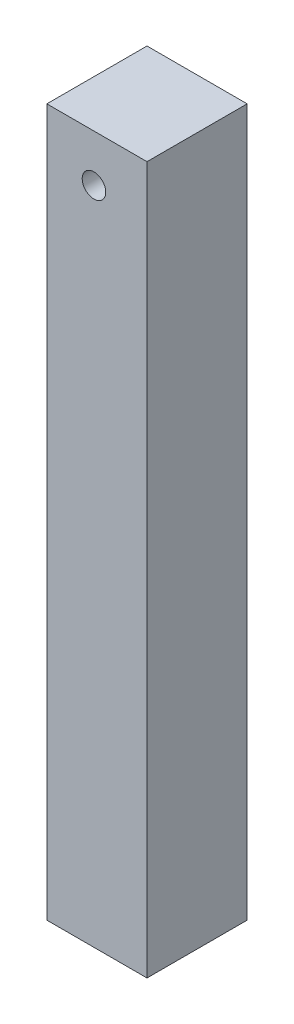
ISO-10303-21;
HEADER;
FILE_DESCRIPTION(('STEP AP214'),'2;1');
FILE_NAME('part.step','',(''),(''),'','','');
FILE_SCHEMA(('AUTOMOTIVE_DESIGN { 1 0 10303 214 1 1 1 1 }'));
ENDSEC;
DATA;
#1=APPLICATION_CONTEXT('core data for automotive mechanical design processes');
#2=APPLICATION_PROTOCOL_DEFINITION('international standard','automotive_design',2000,#1);
#3=PRODUCT_CONTEXT('',#1,'mechanical');
#4=PRODUCT('Part','Part','',(#3));
#5=PRODUCT_RELATED_PRODUCT_CATEGORY('part','',(#4));
#6=PRODUCT_DEFINITION_FORMATION('','',#4);
#7=PRODUCT_DEFINITION_CONTEXT('part definition',#1,'design');
#8=PRODUCT_DEFINITION('design','',#6,#7);
#9=PRODUCT_DEFINITION_SHAPE('','',#8);
#10=(LENGTH_UNIT() NAMED_UNIT(*) SI_UNIT(.MILLI.,.METRE.));
#11=(NAMED_UNIT(*) PLANE_ANGLE_UNIT() SI_UNIT($,.RADIAN.));
#12=(NAMED_UNIT(*) SI_UNIT($,.STERADIAN.) SOLID_ANGLE_UNIT());
#13=UNCERTAINTY_MEASURE_WITH_UNIT(LENGTH_MEASURE(1.E-05),#10,'distance_accuracy_value','');
#14=(GEOMETRIC_REPRESENTATION_CONTEXT(3) GLOBAL_UNCERTAINTY_ASSIGNED_CONTEXT((#13)) GLOBAL_UNIT_ASSIGNED_CONTEXT((#10,
#11,#12)) REPRESENTATION_CONTEXT('',''));
#15=CARTESIAN_POINT('',(0.,0.,0.));
#16=DIRECTION('',(0.,0.,1.));
#17=DIRECTION('',(1.,0.,0.));
#18=AXIS2_PLACEMENT_3D('',#15,#16,#17);
#19=CARTESIAN_POINT('',(0.,152.4,0.));
#20=DIRECTION('',(1.,0.,0.));
#21=DIRECTION('',(0.,0.,-1.));
#22=AXIS2_PLACEMENT_3D('',#19,#20,#21);
#23=PLANE('',#22);
#24=DIRECTION('',(0.,0.,1.));
#25=VECTOR('',#24,1.);
#26=CARTESIAN_POINT('',(0.,0.,0.));
#27=LINE('',#26,#25);
#28=CARTESIAN_POINT('',(0.,0.,0.));
#29=VERTEX_POINT('',#28);
#30=CARTESIAN_POINT('',(0.,0.,21.59));
#31=VERTEX_POINT('',#30);
#32=EDGE_CURVE('E96',#29,#31,#27,.T.);
#33=ORIENTED_EDGE('',*,*,#32,.T.);
#34=DIRECTION('',(0.,-1.,0.));
#35=VECTOR('',#34,1.);
#36=CARTESIAN_POINT('',(0.,152.4,21.59));
#37=LINE('',#36,#35);
#38=CARTESIAN_POINT('',(0.,152.4,21.59));
#39=VERTEX_POINT('',#38);
#40=EDGE_CURVE('E11',#39,#31,#37,.T.);
#41=ORIENTED_EDGE('',*,*,#40,.F.);
#42=DIRECTION('',(0.,0.,1.));
#43=VECTOR('',#42,1.);
#44=CARTESIAN_POINT('',(0.,152.4,0.));
#45=LINE('',#44,#43);
#46=CARTESIAN_POINT('',(0.,152.4,0.));
#47=VERTEX_POINT('',#46);
#48=EDGE_CURVE('E84',#47,#39,#45,.T.);
#49=ORIENTED_EDGE('',*,*,#48,.F.);
#50=DIRECTION('',(0.,-1.,0.));
#51=VECTOR('',#50,1.);
#52=CARTESIAN_POINT('',(0.,152.4,0.));
#53=LINE('',#52,#51);
#54=EDGE_CURVE('E92',#47,#29,#53,.T.);
#55=ORIENTED_EDGE('',*,*,#54,.T.);
#56=EDGE_LOOP('',(#33,#41,#49,#55));
#57=FACE_BOUND('',#56,.T.);
#58=ADVANCED_FACE('F33',(#57),#23,.F.);
#59=CARTESIAN_POINT('',(0.,152.4,21.59));
#60=DIRECTION('',(0.,0.,-1.));
#61=DIRECTION('',(-1.,0.,0.));
#62=AXIS2_PLACEMENT_3D('',#59,#60,#61);
#63=PLANE('',#62);
#64=CARTESIAN_POINT('',(10.16,142.24,21.59));
#65=DIRECTION('',(0.,0.,-1.));
#66=DIRECTION('',(-1.,0.,0.));
#67=AXIS2_PLACEMENT_3D('',#64,#65,#66);
#68=CIRCLE('',#67,2.54000000000002);
#69=CARTESIAN_POINT('',(7.61999999999998,142.24,21.59));
#70=VERTEX_POINT('',#69);
#71=EDGE_CURVE('E99',#70,#70,#68,.F.);
#72=ORIENTED_EDGE('',*,*,#71,.F.);
#73=EDGE_LOOP('',(#72));
#74=FACE_BOUND('',#73,.T.);
#75=DIRECTION('',(1.,0.,0.));
#76=VECTOR('',#75,1.);
#77=CARTESIAN_POINT('',(0.,0.,21.59));
#78=LINE('',#77,#76);
#79=CARTESIAN_POINT('',(21.59,0.,21.59));
#80=VERTEX_POINT('',#79);
#81=EDGE_CURVE('E88',#31,#80,#78,.T.);
#82=ORIENTED_EDGE('',*,*,#81,.T.);
#83=DIRECTION('',(0.,-1.,0.));
#84=VECTOR('',#83,1.);
#85=CARTESIAN_POINT('',(21.59,152.4,21.59));
#86=LINE('',#85,#84);
#87=CARTESIAN_POINT('',(21.59,152.4,21.59));
#88=VERTEX_POINT('',#87);
#89=EDGE_CURVE('E41',#88,#80,#86,.T.);
#90=ORIENTED_EDGE('',*,*,#89,.F.);
#91=DIRECTION('',(1.,0.,0.));
#92=VECTOR('',#91,1.);
#93=CARTESIAN_POINT('',(0.,152.4,21.59));
#94=LINE('',#93,#92);
#95=EDGE_CURVE('E79',#39,#88,#94,.T.);
#96=ORIENTED_EDGE('',*,*,#95,.F.);
#97=ORIENTED_EDGE('',*,*,#40,.T.);
#98=EDGE_LOOP('',(#82,#90,#96,#97));
#99=FACE_BOUND('',#98,.T.);
#100=ADVANCED_FACE('F87',(#74,#99),#63,.F.);
#101=CARTESIAN_POINT('',(21.59,152.4,0.));
#102=DIRECTION('',(-1.,0.,0.));
#103=DIRECTION('',(0.,0.,1.));
#104=AXIS2_PLACEMENT_3D('',#101,#102,#103);
#105=PLANE('',#104);
#106=DIRECTION('',(0.,0.,-1.));
#107=VECTOR('',#106,1.);
#108=CARTESIAN_POINT('',(21.59,0.,0.));
#109=LINE('',#108,#107);
#110=CARTESIAN_POINT('',(21.59,0.,0.));
#111=VERTEX_POINT('',#110);
#112=EDGE_CURVE('E66',#80,#111,#109,.T.);
#113=ORIENTED_EDGE('',*,*,#112,.T.);
#114=DIRECTION('',(0.,-1.,0.));
#115=VECTOR('',#114,1.);
#116=CARTESIAN_POINT('',(21.59,152.4,0.));
#117=LINE('',#116,#115);
#118=CARTESIAN_POINT('',(21.59,152.4,0.));
#119=VERTEX_POINT('',#118);
#120=EDGE_CURVE('E89',#119,#111,#117,.T.);
#121=ORIENTED_EDGE('',*,*,#120,.F.);
#122=DIRECTION('',(0.,0.,-1.));
#123=VECTOR('',#122,1.);
#124=CARTESIAN_POINT('',(21.59,152.4,0.));
#125=LINE('',#124,#123);
#126=EDGE_CURVE('E82',#88,#119,#125,.T.);
#127=ORIENTED_EDGE('',*,*,#126,.F.);
#128=ORIENTED_EDGE('',*,*,#89,.T.);
#129=EDGE_LOOP('',(#113,#121,#127,#128));
#130=FACE_BOUND('',#129,.T.);
#131=ADVANCED_FACE('F90',(#130),#105,.F.);
#132=CARTESIAN_POINT('',(0.,152.4,0.));
#133=DIRECTION('',(0.,0.,1.));
#134=DIRECTION('',(1.,0.,0.));
#135=AXIS2_PLACEMENT_3D('',#132,#133,#134);
#136=PLANE('',#135);
#137=CARTESIAN_POINT('',(10.16,142.24,0.));
#138=DIRECTION('',(0.,0.,1.));
#139=DIRECTION('',(1.,0.,0.));
#140=AXIS2_PLACEMENT_3D('',#137,#138,#139);
#141=CIRCLE('',#140,2.54000000000002);
#142=CARTESIAN_POINT('',(7.61999999999998,142.24,0.));
#143=VERTEX_POINT('',#142);
#144=EDGE_CURVE('E112',#143,#143,#141,.T.);
#145=ORIENTED_EDGE('',*,*,#144,.T.);
#146=EDGE_LOOP('',(#145));
#147=FACE_BOUND('',#146,.T.);
#148=DIRECTION('',(-1.,0.,0.));
#149=VECTOR('',#148,1.);
#150=CARTESIAN_POINT('',(0.,0.,0.));
#151=LINE('',#150,#149);
#152=EDGE_CURVE('E72',#111,#29,#151,.T.);
#153=ORIENTED_EDGE('',*,*,#152,.T.);
#154=ORIENTED_EDGE('',*,*,#54,.F.);
#155=DIRECTION('',(-1.,0.,0.));
#156=VECTOR('',#155,1.);
#157=CARTESIAN_POINT('',(0.,152.4,0.));
#158=LINE('',#157,#156);
#159=EDGE_CURVE('E49',#119,#47,#158,.T.);
#160=ORIENTED_EDGE('',*,*,#159,.F.);
#161=ORIENTED_EDGE('',*,*,#120,.T.);
#162=EDGE_LOOP('',(#153,#154,#160,#161));
#163=FACE_BOUND('',#162,.T.);
#164=ADVANCED_FACE('F104',(#147,#163),#136,.F.);
#165=CARTESIAN_POINT('',(0.,152.4,0.));
#166=DIRECTION('',(0.,1.,0.));
#167=DIRECTION('',(0.,0.,1.));
#168=AXIS2_PLACEMENT_3D('',#165,#166,#167);
#169=PLANE('',#168);
#170=ORIENTED_EDGE('',*,*,#48,.T.);
#171=ORIENTED_EDGE('',*,*,#95,.T.);
#172=ORIENTED_EDGE('',*,*,#126,.T.);
#173=ORIENTED_EDGE('',*,*,#159,.T.);
#174=EDGE_LOOP('',(#170,#171,#172,#173));
#175=FACE_BOUND('',#174,.T.);
#176=ADVANCED_FACE('F80',(#175),#169,.T.);
#177=CARTESIAN_POINT('',(0.,0.,0.));
#178=DIRECTION('',(0.,1.,0.));
#179=DIRECTION('',(0.,0.,1.));
#180=AXIS2_PLACEMENT_3D('',#177,#178,#179);
#181=PLANE('',#180);
#182=ORIENTED_EDGE('',*,*,#32,.F.);
#183=ORIENTED_EDGE('',*,*,#152,.F.);
#184=ORIENTED_EDGE('',*,*,#112,.F.);
#185=ORIENTED_EDGE('',*,*,#81,.F.);
#186=EDGE_LOOP('',(#182,#183,#184,#185));
#187=FACE_BOUND('',#186,.T.);
#188=ADVANCED_FACE('F107',(#187),#181,.F.);
#189=CARTESIAN_POINT('',(10.16,142.24,26.67));
#190=DIRECTION('',(0.,0.,-1.));
#191=DIRECTION('',(-1.,0.,0.));
#192=AXIS2_PLACEMENT_3D('',#189,#190,#191);
#193=CYLINDRICAL_SURFACE('',#192,2.54000000000002);
#194=CARTESIAN_POINT('',(7.61999999999998,142.24,0.));
#195=CARTESIAN_POINT('',(7.61999999999998,142.24,0.22489583333333));
#196=CARTESIAN_POINT('',(7.61999999999998,142.24,0.449791666666663));
#197=CARTESIAN_POINT('',(7.61999999999998,142.24,0.89958333333333));
#198=CARTESIAN_POINT('',(7.61999999999998,142.24,1.12447916666666));
#199=CARTESIAN_POINT('',(7.61999999999998,142.24,1.57427083333333));
#200=CARTESIAN_POINT('',(7.61999999999998,142.24,1.79916666666666));
#201=CARTESIAN_POINT('',(7.61999999999998,142.24,2.24895833333333));
#202=CARTESIAN_POINT('',(7.61999999999998,142.24,2.47385416666666));
#203=CARTESIAN_POINT('',(7.61999999999998,142.24,2.92364583333333));
#204=CARTESIAN_POINT('',(7.61999999999998,142.24,3.14854166666666));
#205=CARTESIAN_POINT('',(7.61999999999998,142.24,3.59833333333333));
#206=CARTESIAN_POINT('',(7.61999999999998,142.24,3.82322916666666));
#207=CARTESIAN_POINT('',(7.61999999999998,142.24,4.27302083333333));
#208=CARTESIAN_POINT('',(7.61999999999998,142.24,4.49791666666666));
#209=CARTESIAN_POINT('',(7.61999999999998,142.24,4.94770833333333));
#210=CARTESIAN_POINT('',(7.61999999999998,142.24,5.17260416666666));
#211=CARTESIAN_POINT('',(7.61999999999998,142.24,5.62239583333333));
#212=CARTESIAN_POINT('',(7.61999999999998,142.24,5.84729166666666));
#213=CARTESIAN_POINT('',(7.61999999999998,142.24,6.29708333333333));
#214=CARTESIAN_POINT('',(7.61999999999998,142.24,6.52197916666666));
#215=CARTESIAN_POINT('',(7.61999999999998,142.24,6.97177083333333));
#216=CARTESIAN_POINT('',(7.61999999999998,142.24,7.19666666666666));
#217=CARTESIAN_POINT('',(7.61999999999998,142.24,7.64645833333333));
#218=CARTESIAN_POINT('',(7.61999999999998,142.24,7.87135416666667));
#219=CARTESIAN_POINT('',(7.61999999999998,142.24,8.32114583333333));
#220=CARTESIAN_POINT('',(7.61999999999998,142.24,8.54604166666667));
#221=CARTESIAN_POINT('',(7.61999999999998,142.24,8.99583333333333));
#222=CARTESIAN_POINT('',(7.61999999999998,142.24,9.22072916666666));
#223=CARTESIAN_POINT('',(7.61999999999998,142.24,9.67052083333333));
#224=CARTESIAN_POINT('',(7.61999999999998,142.24,9.89541666666667));
#225=CARTESIAN_POINT('',(7.61999999999998,142.24,10.3452083333333));
#226=CARTESIAN_POINT('',(7.61999999999998,142.24,10.5701041666667));
#227=CARTESIAN_POINT('',(7.61999999999998,142.24,11.0198958333333));
#228=CARTESIAN_POINT('',(7.61999999999998,142.24,11.2447916666667));
#229=CARTESIAN_POINT('',(7.61999999999998,142.24,11.6945833333333));
#230=CARTESIAN_POINT('',(7.61999999999998,142.24,11.9194791666667));
#231=CARTESIAN_POINT('',(7.61999999999998,142.24,12.3692708333333));
#232=CARTESIAN_POINT('',(7.61999999999998,142.24,12.5941666666667));
#233=CARTESIAN_POINT('',(7.61999999999998,142.24,13.0439583333333));
#234=CARTESIAN_POINT('',(7.61999999999998,142.24,13.2688541666667));
#235=CARTESIAN_POINT('',(7.61999999999998,142.24,13.7186458333333));
#236=CARTESIAN_POINT('',(7.61999999999998,142.24,13.9435416666667));
#237=CARTESIAN_POINT('',(7.61999999999998,142.24,14.3933333333333));
#238=CARTESIAN_POINT('',(7.61999999999998,142.24,14.6182291666667));
#239=CARTESIAN_POINT('',(7.61999999999998,142.24,15.0680208333333));
#240=CARTESIAN_POINT('',(7.61999999999998,142.24,15.2929166666667));
#241=CARTESIAN_POINT('',(7.61999999999998,142.24,15.7427083333333));
#242=CARTESIAN_POINT('',(7.61999999999998,142.24,15.9676041666667));
#243=CARTESIAN_POINT('',(7.61999999999998,142.24,16.4173958333333));
#244=CARTESIAN_POINT('',(7.61999999999998,142.24,16.6422916666667));
#245=CARTESIAN_POINT('',(7.61999999999998,142.24,17.0920833333333));
#246=CARTESIAN_POINT('',(7.61999999999998,142.24,17.3169791666667));
#247=CARTESIAN_POINT('',(7.61999999999998,142.24,17.7667708333333));
#248=CARTESIAN_POINT('',(7.61999999999998,142.24,17.9916666666667));
#249=CARTESIAN_POINT('',(7.61999999999998,142.24,18.4414583333333));
#250=CARTESIAN_POINT('',(7.61999999999998,142.24,18.6663541666667));
#251=CARTESIAN_POINT('',(7.61999999999998,142.24,19.1161458333333));
#252=CARTESIAN_POINT('',(7.61999999999998,142.24,19.3410416666667));
#253=CARTESIAN_POINT('',(7.61999999999998,142.24,19.7908333333333));
#254=CARTESIAN_POINT('',(7.61999999999998,142.24,20.0157291666667));
#255=CARTESIAN_POINT('',(7.61999999999998,142.24,20.4655208333333));
#256=CARTESIAN_POINT('',(7.61999999999998,142.24,20.6904166666667));
#257=CARTESIAN_POINT('',(7.61999999999998,142.24,21.1402083333333));
#258=CARTESIAN_POINT('',(7.61999999999998,142.24,21.3651041666667));
#259=CARTESIAN_POINT('',(7.61999999999998,142.24,21.59));
#260=B_SPLINE_CURVE_WITH_KNOTS('',3,(#194,#195,#196,#197,#198,#199,#200,#201,#202,#203,#204,
#205,#206,#207,#208,#209,#210,#211,#212,#213,#214,#215,#216,#217,#218,#219,#220,#221,#222,#223,
#224,#225,#226,#227,#228,#229,#230,#231,#232,#233,#234,#235,#236,#237,#238,#239,#240,#241,#242,
#243,#244,#245,#246,#247,#248,#249,#250,#251,#252,#253,#254,#255,#256,#257,#258,#259),
.UNSPECIFIED.,.F.,.F.,(4,2,2,2,2,2,2,2,2,2,2,2,2,2,2,2,2,2,2,2,2,2,2,2,2,2,2,2,2,2,2,2,4),(0.,
0.6746875,1.349375,2.0240625,2.69875,3.3734375,4.048125,4.7228125,5.3975,6.0721875,6.746875,
7.4215625,8.09625,8.7709375,9.445625,10.1203125,10.795,11.4696875,12.144375,12.8190625,13.49375,
14.1684375,14.843125,15.5178125,16.1925,16.8671875,17.541875,18.2165625,18.89125,19.5659375,
20.240625,20.9153125,21.59),.UNSPECIFIED.);
#261=EDGE_CURVE('BSEAM117',#143,#70,#260,.T.);
#262=ORIENTED_EDGE('',*,*,#144,.F.);
#263=ORIENTED_EDGE('',*,*,#71,.T.);
#264=ORIENTED_EDGE('',*,*,#261,.T.);
#265=ORIENTED_EDGE('',*,*,#261,.F.);
#266=EDGE_LOOP('',(#262,#264,#263,#265));
#267=FACE_BOUND('',#266,.T.);
#268=ADVANCED_FACE('F117',(#267),#193,.F.);
#269=CLOSED_SHELL('',(#58,#100,#131,#164,#176,#188,#268));
#270=MANIFOLD_SOLID_BREP('B2',#269);
#271=ADVANCED_BREP_SHAPE_REPRESENTATION('',(#18,#270),#14);
#272=SHAPE_DEFINITION_REPRESENTATION(#9,#271);
ENDSEC;
END-ISO-10303-21;
